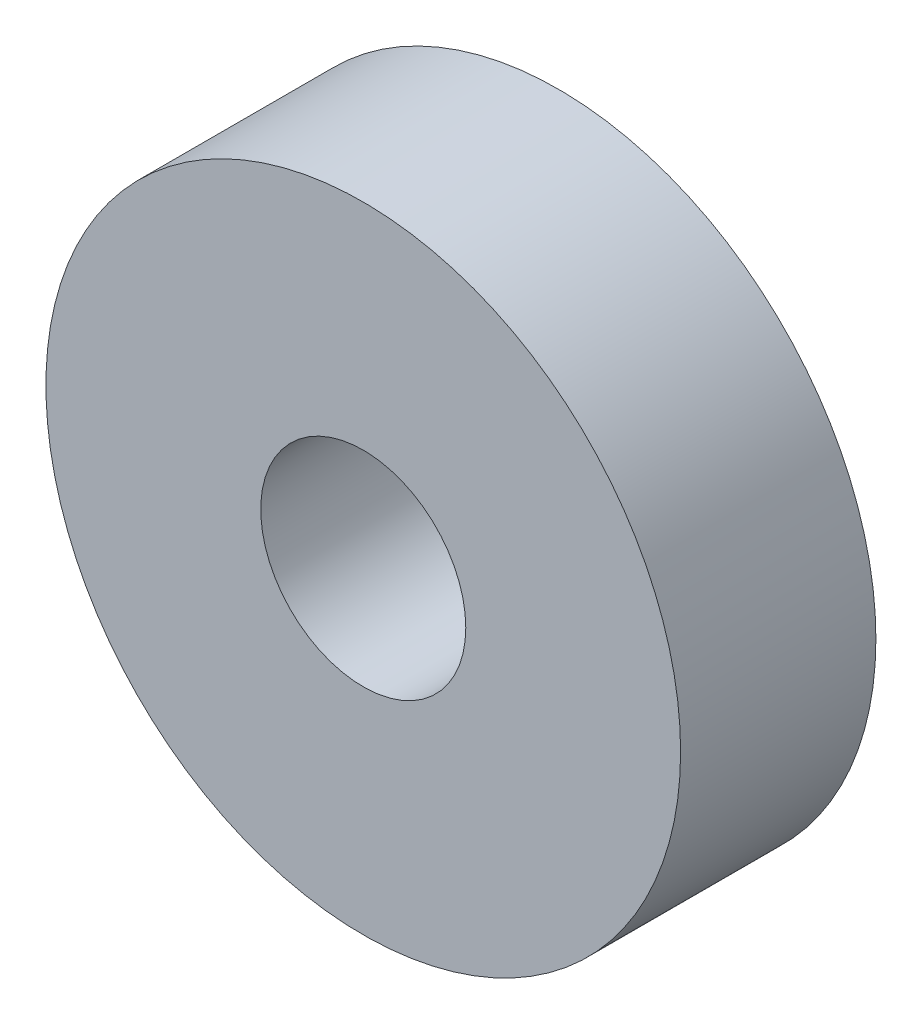
ISO-10303-21;
HEADER;
FILE_DESCRIPTION(('STEP AP214'),'2;1');
FILE_NAME('part.step','',(''),(''),'','','');
FILE_SCHEMA(('AUTOMOTIVE_DESIGN { 1 0 10303 214 1 1 1 1 }'));
ENDSEC;
DATA;
#1=APPLICATION_CONTEXT('core data for automotive mechanical design processes');
#2=APPLICATION_PROTOCOL_DEFINITION('international standard','automotive_design',2000,#1);
#3=PRODUCT_CONTEXT('',#1,'mechanical');
#4=PRODUCT('Part','Part','',(#3));
#5=PRODUCT_RELATED_PRODUCT_CATEGORY('part','',(#4));
#6=PRODUCT_DEFINITION_FORMATION('','',#4);
#7=PRODUCT_DEFINITION_CONTEXT('part definition',#1,'design');
#8=PRODUCT_DEFINITION('design','',#6,#7);
#9=PRODUCT_DEFINITION_SHAPE('','',#8);
#10=(LENGTH_UNIT() NAMED_UNIT(*) SI_UNIT(.MILLI.,.METRE.));
#11=(NAMED_UNIT(*) PLANE_ANGLE_UNIT() SI_UNIT($,.RADIAN.));
#12=(NAMED_UNIT(*) SI_UNIT($,.STERADIAN.) SOLID_ANGLE_UNIT());
#13=UNCERTAINTY_MEASURE_WITH_UNIT(LENGTH_MEASURE(1.E-05),#10,'distance_accuracy_value','');
#14=(GEOMETRIC_REPRESENTATION_CONTEXT(3) GLOBAL_UNCERTAINTY_ASSIGNED_CONTEXT((#13)) GLOBAL_UNIT_ASSIGNED_CONTEXT((#10,
#11,#12)) REPRESENTATION_CONTEXT('',''));
#15=CARTESIAN_POINT('',(0.,0.,0.));
#16=DIRECTION('',(0.,0.,1.));
#17=DIRECTION('',(1.,0.,0.));
#18=AXIS2_PLACEMENT_3D('',#15,#16,#17);
#19=CARTESIAN_POINT('',(0.,0.,4.));
#20=DIRECTION('',(0.,0.,1.));
#21=DIRECTION('',(1.,0.,0.));
#22=AXIS2_PLACEMENT_3D('',#19,#20,#21);
#23=PLANE('',#22);
#24=CARTESIAN_POINT('',(0.,0.,4.));
#25=DIRECTION('',(0.,0.,1.));
#26=DIRECTION('',(1.,0.,0.));
#27=AXIS2_PLACEMENT_3D('',#24,#25,#26);
#28=CIRCLE('',#27,6.5);
#29=CARTESIAN_POINT('',(6.5,0.,4.));
#30=VERTEX_POINT('',#29);
#31=EDGE_CURVE('E10',#30,#30,#28,.T.);
#32=ORIENTED_EDGE('',*,*,#31,.T.);
#33=EDGE_LOOP('',(#32));
#34=FACE_BOUND('',#33,.T.);
#35=CARTESIAN_POINT('',(0.,0.,4.));
#36=DIRECTION('',(0.,0.,1.));
#37=DIRECTION('',(1.,0.,0.));
#38=AXIS2_PLACEMENT_3D('',#35,#36,#37);
#39=CIRCLE('',#38,2.1);
#40=CARTESIAN_POINT('',(2.1,0.,4.));
#41=VERTEX_POINT('',#40);
#42=EDGE_CURVE('E43',#41,#41,#39,.T.);
#43=ORIENTED_EDGE('',*,*,#42,.F.);
#44=EDGE_LOOP('',(#43));
#45=FACE_BOUND('',#44,.T.);
#46=ADVANCED_FACE('F32',(#34,#45),#23,.T.);
#47=CARTESIAN_POINT('',(0.,0.,0.));
#48=DIRECTION('',(0.,0.,1.));
#49=DIRECTION('',(1.,0.,0.));
#50=AXIS2_PLACEMENT_3D('',#47,#48,#49);
#51=PLANE('',#50);
#52=CARTESIAN_POINT('',(0.,0.,0.));
#53=DIRECTION('',(0.,0.,1.));
#54=DIRECTION('',(1.,0.,0.));
#55=AXIS2_PLACEMENT_3D('',#52,#53,#54);
#56=CIRCLE('',#55,6.5);
#57=CARTESIAN_POINT('',(6.5,0.,0.));
#58=VERTEX_POINT('',#57);
#59=EDGE_CURVE('E36',#58,#58,#56,.T.);
#60=ORIENTED_EDGE('',*,*,#59,.F.);
#61=EDGE_LOOP('',(#60));
#62=FACE_BOUND('',#61,.T.);
#63=CARTESIAN_POINT('',(0.,0.,0.));
#64=DIRECTION('',(0.,0.,1.));
#65=DIRECTION('',(1.,0.,0.));
#66=AXIS2_PLACEMENT_3D('',#63,#64,#65);
#67=CIRCLE('',#66,2.1);
#68=CARTESIAN_POINT('',(2.1,0.,0.));
#69=VERTEX_POINT('',#68);
#70=EDGE_CURVE('E45',#69,#69,#67,.T.);
#71=ORIENTED_EDGE('',*,*,#70,.T.);
#72=EDGE_LOOP('',(#71));
#73=FACE_BOUND('',#72,.T.);
#74=ADVANCED_FACE('F55',(#62,#73),#51,.F.);
#75=CARTESIAN_POINT('',(0.,0.,4.));
#76=DIRECTION('',(0.,0.,-1.));
#77=DIRECTION('',(-1.,0.,0.));
#78=AXIS2_PLACEMENT_3D('',#75,#76,#77);
#79=CYLINDRICAL_SURFACE('',#78,6.5);
#80=ORIENTED_EDGE('',*,*,#31,.F.);
#81=EDGE_LOOP('',(#80));
#82=FACE_BOUND('',#81,.T.);
#83=ORIENTED_EDGE('',*,*,#59,.T.);
#84=EDGE_LOOP('',(#83));
#85=FACE_BOUND('',#84,.T.);
#86=ADVANCED_FACE('F34',(#82,#85),#79,.T.);
#87=CARTESIAN_POINT('',(0.,0.,4.));
#88=DIRECTION('',(0.,0.,-1.));
#89=DIRECTION('',(-1.,0.,0.));
#90=AXIS2_PLACEMENT_3D('',#87,#88,#89);
#91=CYLINDRICAL_SURFACE('',#90,2.1);
#92=ORIENTED_EDGE('',*,*,#42,.T.);
#93=EDGE_LOOP('',(#92));
#94=FACE_BOUND('',#93,.T.);
#95=ORIENTED_EDGE('',*,*,#70,.F.);
#96=EDGE_LOOP('',(#95));
#97=FACE_BOUND('',#96,.T.);
#98=ADVANCED_FACE('F51',(#94,#97),#91,.F.);
#99=CLOSED_SHELL('',(#46,#74,#86,#98));
#100=MANIFOLD_SOLID_BREP('B2',#99);
#101=ADVANCED_BREP_SHAPE_REPRESENTATION('',(#18,#100),#14);
#102=SHAPE_DEFINITION_REPRESENTATION(#9,#101);
ENDSEC;
END-ISO-10303-21;
